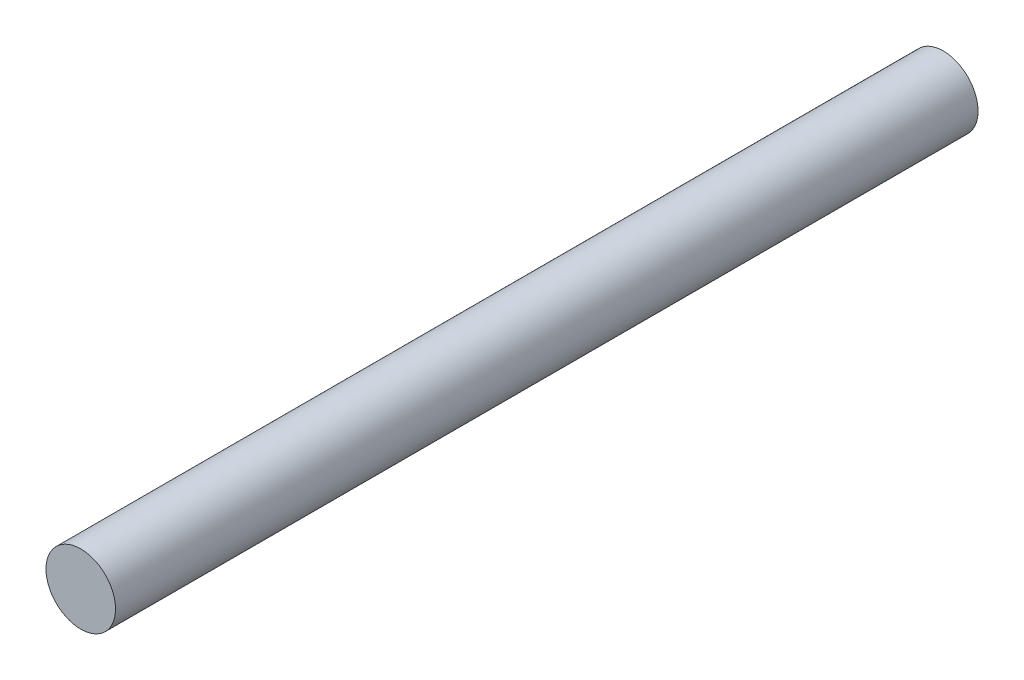
ISO-10303-21;
HEADER;
FILE_DESCRIPTION(('STEP AP214'),'2;1');
FILE_NAME('part.step','',(''),(''),'','','');
FILE_SCHEMA(('AUTOMOTIVE_DESIGN { 1 0 10303 214 1 1 1 1 }'));
ENDSEC;
DATA;
#1=APPLICATION_CONTEXT('core data for automotive mechanical design processes');
#2=APPLICATION_PROTOCOL_DEFINITION('international standard','automotive_design',2000,#1);
#3=PRODUCT_CONTEXT('',#1,'mechanical');
#4=PRODUCT('Part','Part','',(#3));
#5=PRODUCT_RELATED_PRODUCT_CATEGORY('part','',(#4));
#6=PRODUCT_DEFINITION_FORMATION('','',#4);
#7=PRODUCT_DEFINITION_CONTEXT('part definition',#1,'design');
#8=PRODUCT_DEFINITION('design','',#6,#7);
#9=PRODUCT_DEFINITION_SHAPE('','',#8);
#10=(LENGTH_UNIT() NAMED_UNIT(*) SI_UNIT(.MILLI.,.METRE.));
#11=(NAMED_UNIT(*) PLANE_ANGLE_UNIT() SI_UNIT($,.RADIAN.));
#12=(NAMED_UNIT(*) SI_UNIT($,.STERADIAN.) SOLID_ANGLE_UNIT());
#13=UNCERTAINTY_MEASURE_WITH_UNIT(LENGTH_MEASURE(1.E-05),#10,'distance_accuracy_value','');
#14=(GEOMETRIC_REPRESENTATION_CONTEXT(3) GLOBAL_UNCERTAINTY_ASSIGNED_CONTEXT((#13)) GLOBAL_UNIT_ASSIGNED_CONTEXT((#10,
#11,#12)) REPRESENTATION_CONTEXT('',''));
#15=CARTESIAN_POINT('',(0.,0.,0.));
#16=DIRECTION('',(0.,0.,1.));
#17=DIRECTION('',(1.,0.,0.));
#18=AXIS2_PLACEMENT_3D('',#15,#16,#17);
#19=CARTESIAN_POINT('',(0.,0.,24.8));
#20=DIRECTION('',(0.,0.,-1.));
#21=DIRECTION('',(-1.,0.,0.));
#22=AXIS2_PLACEMENT_3D('',#19,#20,#21);
#23=CYLINDRICAL_SURFACE('',#22,1.);
#24=CARTESIAN_POINT('',(0.,0.,24.8));
#25=DIRECTION('',(0.,0.,1.));
#26=DIRECTION('',(1.,0.,0.));
#27=AXIS2_PLACEMENT_3D('',#24,#25,#26);
#28=CIRCLE('',#27,1.);
#29=CARTESIAN_POINT('',(-1.,0.,24.8));
#30=VERTEX_POINT('',#29);
#31=EDGE_CURVE('E10',#30,#30,#28,.T.);
#32=CARTESIAN_POINT('',(0.,0.,0.));
#33=DIRECTION('',(0.,0.,1.));
#34=DIRECTION('',(1.,0.,0.));
#35=AXIS2_PLACEMENT_3D('',#32,#33,#34);
#36=CIRCLE('',#35,1.);
#37=CARTESIAN_POINT('',(-1.,0.,0.));
#38=VERTEX_POINT('',#37);
#39=EDGE_CURVE('E46',#38,#38,#36,.T.);
#40=CARTESIAN_POINT('',(-1.,0.,24.8));
#41=CARTESIAN_POINT('',(-1.,0.,24.5416666666667));
#42=CARTESIAN_POINT('',(-1.,0.,24.2833333333333));
#43=CARTESIAN_POINT('',(-1.,0.,23.7666666666667));
#44=CARTESIAN_POINT('',(-1.,0.,23.5083333333333));
#45=CARTESIAN_POINT('',(-1.,0.,22.9916666666667));
#46=CARTESIAN_POINT('',(-1.,0.,22.7333333333333));
#47=CARTESIAN_POINT('',(-1.,0.,22.2166666666667));
#48=CARTESIAN_POINT('',(-1.,0.,21.9583333333333));
#49=CARTESIAN_POINT('',(-1.,0.,21.4416666666667));
#50=CARTESIAN_POINT('',(-1.,0.,21.1833333333333));
#51=CARTESIAN_POINT('',(-1.,0.,20.6666666666667));
#52=CARTESIAN_POINT('',(-1.,0.,20.4083333333333));
#53=CARTESIAN_POINT('',(-1.,0.,19.8916666666667));
#54=CARTESIAN_POINT('',(-1.,0.,19.6333333333333));
#55=CARTESIAN_POINT('',(-1.,0.,19.1166666666667));
#56=CARTESIAN_POINT('',(-1.,0.,18.8583333333333));
#57=CARTESIAN_POINT('',(-1.,0.,18.3416666666667));
#58=CARTESIAN_POINT('',(-1.,0.,18.0833333333333));
#59=CARTESIAN_POINT('',(-1.,0.,17.5666666666667));
#60=CARTESIAN_POINT('',(-1.,0.,17.3083333333333));
#61=CARTESIAN_POINT('',(-1.,0.,16.7916666666667));
#62=CARTESIAN_POINT('',(-1.,0.,16.5333333333333));
#63=CARTESIAN_POINT('',(-1.,0.,16.0166666666667));
#64=CARTESIAN_POINT('',(-1.,0.,15.7583333333333));
#65=CARTESIAN_POINT('',(-1.,0.,15.2416666666667));
#66=CARTESIAN_POINT('',(-1.,0.,14.9833333333333));
#67=CARTESIAN_POINT('',(-1.,0.,14.4666666666667));
#68=CARTESIAN_POINT('',(-1.,0.,14.2083333333333));
#69=CARTESIAN_POINT('',(-1.,0.,13.6916666666667));
#70=CARTESIAN_POINT('',(-1.,0.,13.4333333333333));
#71=CARTESIAN_POINT('',(-1.,0.,12.9166666666667));
#72=CARTESIAN_POINT('',(-1.,0.,12.6583333333333));
#73=CARTESIAN_POINT('',(-1.,0.,12.1416666666667));
#74=CARTESIAN_POINT('',(-1.,0.,11.8833333333333));
#75=CARTESIAN_POINT('',(-1.,0.,11.3666666666667));
#76=CARTESIAN_POINT('',(-1.,0.,11.1083333333333));
#77=CARTESIAN_POINT('',(-1.,0.,10.5916666666667));
#78=CARTESIAN_POINT('',(-1.,0.,10.3333333333333));
#79=CARTESIAN_POINT('',(-1.,0.,9.81666666666666));
#80=CARTESIAN_POINT('',(-1.,0.,9.55833333333333));
#81=CARTESIAN_POINT('',(-1.,0.,9.04166666666666));
#82=CARTESIAN_POINT('',(-1.,0.,8.78333333333333));
#83=CARTESIAN_POINT('',(-1.,0.,8.26666666666667));
#84=CARTESIAN_POINT('',(-1.,0.,8.00833333333333));
#85=CARTESIAN_POINT('',(-1.,0.,7.49166666666667));
#86=CARTESIAN_POINT('',(-1.,0.,7.23333333333333));
#87=CARTESIAN_POINT('',(-1.,0.,6.71666666666667));
#88=CARTESIAN_POINT('',(-1.,0.,6.45833333333333));
#89=CARTESIAN_POINT('',(-1.,0.,5.94166666666667));
#90=CARTESIAN_POINT('',(-1.,0.,5.68333333333333));
#91=CARTESIAN_POINT('',(-1.,0.,5.16666666666667));
#92=CARTESIAN_POINT('',(-1.,0.,4.90833333333333));
#93=CARTESIAN_POINT('',(-1.,0.,4.39166666666667));
#94=CARTESIAN_POINT('',(-1.,0.,4.13333333333333));
#95=CARTESIAN_POINT('',(-1.,0.,3.61666666666667));
#96=CARTESIAN_POINT('',(-1.,0.,3.35833333333333));
#97=CARTESIAN_POINT('',(-1.,0.,2.84166666666667));
#98=CARTESIAN_POINT('',(-1.,0.,2.58333333333333));
#99=CARTESIAN_POINT('',(-1.,0.,2.06666666666667));
#100=CARTESIAN_POINT('',(-1.,0.,1.80833333333333));
#101=CARTESIAN_POINT('',(-1.,0.,1.29166666666667));
#102=CARTESIAN_POINT('',(-1.,0.,1.03333333333333));
#103=CARTESIAN_POINT('',(-1.,0.,0.516666666666668));
#104=CARTESIAN_POINT('',(-1.,0.,0.258333333333334));
#105=CARTESIAN_POINT('',(-1.,0.,0.));
#106=B_SPLINE_CURVE_WITH_KNOTS('',3,(#40,#41,#42,#43,#44,#45,#46,#47,#48,#49,#50,#51,#52,#53,
#54,#55,#56,#57,#58,#59,#60,#61,#62,#63,#64,#65,#66,#67,#68,#69,#70,#71,#72,#73,#74,#75,#76,#77,
#78,#79,#80,#81,#82,#83,#84,#85,#86,#87,#88,#89,#90,#91,#92,#93,#94,#95,#96,#97,#98,#99,#100,
#101,#102,#103,#104,#105),.UNSPECIFIED.,.F.,.F.,(4,2,2,2,2,2,2,2,2,2,2,2,2,2,2,2,2,2,2,2,2,2,2,
2,2,2,2,2,2,2,2,2,4),(0.,0.775000000000001,1.55,2.325,3.1,3.875,4.65,5.425,6.2,6.975,7.75,8.525,
9.3,10.075,10.85,11.625,12.4,13.175,13.95,14.725,15.5,16.275,17.05,17.825,18.6,19.375,20.15,
20.925,21.7,22.475,23.25,24.025,24.8),.UNSPECIFIED.);
#107=EDGE_CURVE('BSEAM43',#30,#38,#106,.T.);
#108=ORIENTED_EDGE('',*,*,#31,.F.);
#109=ORIENTED_EDGE('',*,*,#39,.T.);
#110=ORIENTED_EDGE('',*,*,#107,.T.);
#111=ORIENTED_EDGE('',*,*,#107,.F.);
#112=EDGE_LOOP('',(#108,#110,#109,#111));
#113=FACE_BOUND('',#112,.T.);
#114=ADVANCED_FACE('F43',(#113),#23,.T.);
#115=CARTESIAN_POINT('',(0.,0.,24.8));
#116=DIRECTION('',(0.,0.,1.));
#117=DIRECTION('',(1.,0.,0.));
#118=AXIS2_PLACEMENT_3D('',#115,#116,#117);
#119=PLANE('',#118);
#120=ORIENTED_EDGE('',*,*,#31,.T.);
#121=EDGE_LOOP('',(#120));
#122=FACE_BOUND('',#121,.T.);
#123=ADVANCED_FACE('F58',(#122),#119,.T.);
#124=CARTESIAN_POINT('',(0.,0.,0.));
#125=DIRECTION('',(0.,0.,1.));
#126=DIRECTION('',(1.,0.,0.));
#127=AXIS2_PLACEMENT_3D('',#124,#125,#126);
#128=PLANE('',#127);
#129=ORIENTED_EDGE('',*,*,#39,.F.);
#130=EDGE_LOOP('',(#129));
#131=FACE_BOUND('',#130,.T.);
#132=ADVANCED_FACE('F59',(#131),#128,.F.);
#133=CLOSED_SHELL('',(#114,#123,#132));
#134=MANIFOLD_SOLID_BREP('B2',#133);
#135=ADVANCED_BREP_SHAPE_REPRESENTATION('',(#18,#134),#14);
#136=SHAPE_DEFINITION_REPRESENTATION(#9,#135);
ENDSEC;
END-ISO-10303-21;
